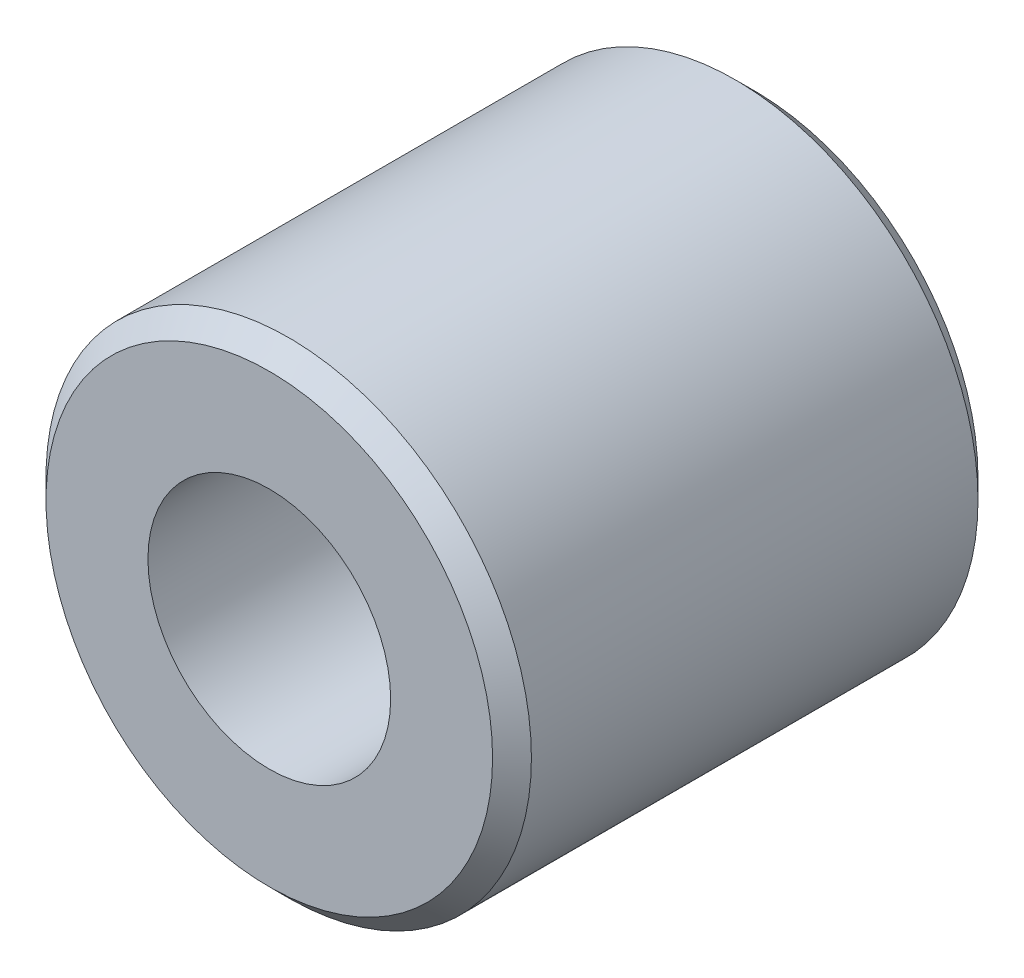
ISO-10303-21;
HEADER;
FILE_DESCRIPTION(('STEP AP214'),'2;1');
FILE_NAME('part.step','',(''),(''),'','','');
FILE_SCHEMA(('AUTOMOTIVE_DESIGN { 1 0 10303 214 1 1 1 1 }'));
ENDSEC;
DATA;
#1=APPLICATION_CONTEXT('core data for automotive mechanical design processes');
#2=APPLICATION_PROTOCOL_DEFINITION('international standard','automotive_design',2000,#1);
#3=PRODUCT_CONTEXT('',#1,'mechanical');
#4=PRODUCT('Part','Part','',(#3));
#5=PRODUCT_RELATED_PRODUCT_CATEGORY('part','',(#4));
#6=PRODUCT_DEFINITION_FORMATION('','',#4);
#7=PRODUCT_DEFINITION_CONTEXT('part definition',#1,'design');
#8=PRODUCT_DEFINITION('design','',#6,#7);
#9=PRODUCT_DEFINITION_SHAPE('','',#8);
#10=(LENGTH_UNIT() NAMED_UNIT(*) SI_UNIT(.MILLI.,.METRE.));
#11=(NAMED_UNIT(*) PLANE_ANGLE_UNIT() SI_UNIT($,.RADIAN.));
#12=(NAMED_UNIT(*) SI_UNIT($,.STERADIAN.) SOLID_ANGLE_UNIT());
#13=UNCERTAINTY_MEASURE_WITH_UNIT(LENGTH_MEASURE(1.E-05),#10,'distance_accuracy_value','');
#14=(GEOMETRIC_REPRESENTATION_CONTEXT(3) GLOBAL_UNCERTAINTY_ASSIGNED_CONTEXT((#13)) GLOBAL_UNIT_ASSIGNED_CONTEXT((#10,
#11,#12)) REPRESENTATION_CONTEXT('',''));
#15=CARTESIAN_POINT('',(0.,0.,0.));
#16=DIRECTION('',(0.,0.,1.));
#17=DIRECTION('',(1.,0.,0.));
#18=AXIS2_PLACEMENT_3D('',#15,#16,#17);
#19=CARTESIAN_POINT('',(0.,0.,5.));
#20=DIRECTION('',(0.,0.,1.));
#21=DIRECTION('',(1.,0.,0.));
#22=AXIS2_PLACEMENT_3D('',#19,#20,#21);
#23=PLANE('',#22);
#24=CARTESIAN_POINT('',(0.,0.,5.));
#25=DIRECTION('',(0.,0.,1.));
#26=DIRECTION('',(1.,0.,0.));
#27=AXIS2_PLACEMENT_3D('',#24,#25,#26);
#28=CIRCLE('',#27,2.3);
#29=CARTESIAN_POINT('',(2.3,0.,5.));
#30=VERTEX_POINT('',#29);
#31=EDGE_CURVE('E10',#30,#30,#28,.T.);
#32=ORIENTED_EDGE('',*,*,#31,.T.);
#33=EDGE_LOOP('',(#32));
#34=FACE_BOUND('',#33,.T.);
#35=CARTESIAN_POINT('',(0.,0.,5.));
#36=DIRECTION('',(0.,0.,1.));
#37=DIRECTION('',(1.,0.,0.));
#38=AXIS2_PLACEMENT_3D('',#35,#36,#37);
#39=CIRCLE('',#38,1.25);
#40=CARTESIAN_POINT('',(1.25,0.,5.));
#41=VERTEX_POINT('',#40);
#42=EDGE_CURVE('E61',#41,#41,#39,.T.);
#43=ORIENTED_EDGE('',*,*,#42,.F.);
#44=EDGE_LOOP('',(#43));
#45=FACE_BOUND('',#44,.T.);
#46=ADVANCED_FACE('F40',(#34,#45),#23,.T.);
#47=CARTESIAN_POINT('',(0.,0.,0.));
#48=DIRECTION('',(0.,0.,1.));
#49=DIRECTION('',(1.,0.,0.));
#50=AXIS2_PLACEMENT_3D('',#47,#48,#49);
#51=PLANE('',#50);
#52=CARTESIAN_POINT('',(0.,0.,0.));
#53=DIRECTION('',(0.,0.,1.));
#54=DIRECTION('',(1.,0.,0.));
#55=AXIS2_PLACEMENT_3D('',#52,#53,#54);
#56=CIRCLE('',#55,2.3);
#57=CARTESIAN_POINT('',(2.3,0.,0.));
#58=VERTEX_POINT('',#57);
#59=EDGE_CURVE('E48',#58,#58,#56,.F.);
#60=ORIENTED_EDGE('',*,*,#59,.T.);
#61=EDGE_LOOP('',(#60));
#62=FACE_BOUND('',#61,.T.);
#63=CARTESIAN_POINT('',(0.,0.,0.));
#64=DIRECTION('',(0.,0.,1.));
#65=DIRECTION('',(1.,0.,0.));
#66=AXIS2_PLACEMENT_3D('',#63,#64,#65);
#67=CIRCLE('',#66,1.25);
#68=CARTESIAN_POINT('',(1.25,0.,0.));
#69=VERTEX_POINT('',#68);
#70=EDGE_CURVE('E62',#69,#69,#67,.T.);
#71=ORIENTED_EDGE('',*,*,#70,.T.);
#72=EDGE_LOOP('',(#71));
#73=FACE_BOUND('',#72,.T.);
#74=ADVANCED_FACE('F72',(#62,#73),#51,.F.);
#75=CARTESIAN_POINT('',(0.,0.,5.));
#76=DIRECTION('',(0.,0.,-1.));
#77=DIRECTION('',(-1.,0.,0.));
#78=AXIS2_PLACEMENT_3D('',#75,#76,#77);
#79=CYLINDRICAL_SURFACE('',#78,2.5);
#80=CARTESIAN_POINT('',(0.,0.,0.2));
#81=DIRECTION('',(0.,0.,1.));
#82=DIRECTION('',(1.,0.,0.));
#83=AXIS2_PLACEMENT_3D('',#80,#81,#82);
#84=CIRCLE('',#83,2.5);
#85=CARTESIAN_POINT('',(2.5,0.,0.2));
#86=VERTEX_POINT('',#85);
#87=EDGE_CURVE('E52',#86,#86,#84,.T.);
#88=ORIENTED_EDGE('',*,*,#87,.T.);
#89=EDGE_LOOP('',(#88));
#90=FACE_BOUND('',#89,.T.);
#91=CARTESIAN_POINT('',(0.,0.,4.8));
#92=DIRECTION('',(0.,0.,1.));
#93=DIRECTION('',(1.,0.,0.));
#94=AXIS2_PLACEMENT_3D('',#91,#92,#93);
#95=CIRCLE('',#94,2.5);
#96=CARTESIAN_POINT('',(2.5,0.,4.8));
#97=VERTEX_POINT('',#96);
#98=EDGE_CURVE('E56',#97,#97,#95,.F.);
#99=ORIENTED_EDGE('',*,*,#98,.T.);
#100=EDGE_LOOP('',(#99));
#101=FACE_BOUND('',#100,.T.);
#102=ADVANCED_FACE('F77',(#90,#101),#79,.T.);
#103=CARTESIAN_POINT('',(0.,0.,5.));
#104=DIRECTION('',(0.,0.,-1.));
#105=DIRECTION('',(-1.,0.,0.));
#106=AXIS2_PLACEMENT_3D('',#103,#104,#105);
#107=CYLINDRICAL_SURFACE('',#106,1.25);
#108=ORIENTED_EDGE('',*,*,#42,.T.);
#109=EDGE_LOOP('',(#108));
#110=FACE_BOUND('',#109,.T.);
#111=ORIENTED_EDGE('',*,*,#70,.F.);
#112=EDGE_LOOP('',(#111));
#113=FACE_BOUND('',#112,.T.);
#114=ADVANCED_FACE('F68',(#110,#113),#107,.F.);
#115=CARTESIAN_POINT('',(0.,0.,0.2));
#116=DIRECTION('',(0.,0.,1.));
#117=DIRECTION('',(1.,0.,0.));
#118=AXIS2_PLACEMENT_3D('',#115,#116,#117);
#119=CONICAL_SURFACE('',#118,2.5,0.785398163397449);
#120=CARTESIAN_POINT('',(2.3,0.,0.));
#121=CARTESIAN_POINT('',(2.30208333333333,0.,0.00208333333333336));
#122=CARTESIAN_POINT('',(2.30416666666667,0.,0.00416666666666668));
#123=CARTESIAN_POINT('',(2.30833333333333,0.,0.00833333333333332));
#124=CARTESIAN_POINT('',(2.31041666666667,0.,0.0104166666666666));
#125=CARTESIAN_POINT('',(2.31458333333333,0.,0.0145833333333333));
#126=CARTESIAN_POINT('',(2.31666666666667,0.,0.0166666666666666));
#127=CARTESIAN_POINT('',(2.32083333333333,0.,0.0208333333333332));
#128=CARTESIAN_POINT('',(2.32291666666667,0.,0.0229166666666666));
#129=CARTESIAN_POINT('',(2.32708333333333,0.,0.0270833333333333));
#130=CARTESIAN_POINT('',(2.32916666666667,0.,0.0291666666666666));
#131=CARTESIAN_POINT('',(2.33333333333333,0.,0.0333333333333332));
#132=CARTESIAN_POINT('',(2.33541666666667,0.,0.0354166666666666));
#133=CARTESIAN_POINT('',(2.33958333333333,0.,0.0395833333333333));
#134=CARTESIAN_POINT('',(2.34166666666667,0.,0.0416666666666666));
#135=CARTESIAN_POINT('',(2.34583333333333,0.,0.0458333333333332));
#136=CARTESIAN_POINT('',(2.34791666666667,0.,0.0479166666666665));
#137=CARTESIAN_POINT('',(2.35208333333333,0.,0.0520833333333332));
#138=CARTESIAN_POINT('',(2.35416666666667,0.,0.0541666666666666));
#139=CARTESIAN_POINT('',(2.35833333333333,0.,0.0583333333333333));
#140=CARTESIAN_POINT('',(2.36041666666667,0.,0.0604166666666665));
#141=CARTESIAN_POINT('',(2.36458333333333,0.,0.0645833333333332));
#142=CARTESIAN_POINT('',(2.36666666666667,0.,0.0666666666666666));
#143=CARTESIAN_POINT('',(2.37083333333333,0.,0.0708333333333333));
#144=CARTESIAN_POINT('',(2.37291666666667,0.,0.0729166666666666));
#145=CARTESIAN_POINT('',(2.37708333333333,0.,0.0770833333333332));
#146=CARTESIAN_POINT('',(2.37916666666667,0.,0.0791666666666665));
#147=CARTESIAN_POINT('',(2.38333333333333,0.,0.0833333333333331));
#148=CARTESIAN_POINT('',(2.38541666666667,0.,0.0854166666666665));
#149=CARTESIAN_POINT('',(2.38958333333333,0.,0.0895833333333332));
#150=CARTESIAN_POINT('',(2.39166666666667,0.,0.0916666666666665));
#151=CARTESIAN_POINT('',(2.39583333333333,0.,0.0958333333333331));
#152=CARTESIAN_POINT('',(2.39791666666667,0.,0.0979166666666665));
#153=CARTESIAN_POINT('',(2.40208333333333,0.,0.102083333333333));
#154=CARTESIAN_POINT('',(2.40416666666667,0.,0.104166666666666));
#155=CARTESIAN_POINT('',(2.40833333333333,0.,0.108333333333333));
#156=CARTESIAN_POINT('',(2.41041666666667,0.,0.110416666666666));
#157=CARTESIAN_POINT('',(2.41458333333333,0.,0.114583333333333));
#158=CARTESIAN_POINT('',(2.41666666666667,0.,0.116666666666666));
#159=CARTESIAN_POINT('',(2.42083333333333,0.,0.120833333333333));
#160=CARTESIAN_POINT('',(2.42291666666667,0.,0.122916666666666));
#161=CARTESIAN_POINT('',(2.42708333333333,0.,0.127083333333333));
#162=CARTESIAN_POINT('',(2.42916666666667,0.,0.129166666666666));
#163=CARTESIAN_POINT('',(2.43333333333333,0.,0.133333333333333));
#164=CARTESIAN_POINT('',(2.43541666666667,0.,0.135416666666666));
#165=CARTESIAN_POINT('',(2.43958333333333,0.,0.139583333333333));
#166=CARTESIAN_POINT('',(2.44166666666667,0.,0.141666666666666));
#167=CARTESIAN_POINT('',(2.44583333333333,0.,0.145833333333333));
#168=CARTESIAN_POINT('',(2.44791666666667,0.,0.147916666666666));
#169=CARTESIAN_POINT('',(2.45208333333333,0.,0.152083333333333));
#170=CARTESIAN_POINT('',(2.45416666666667,0.,0.154166666666666));
#171=CARTESIAN_POINT('',(2.45833333333333,0.,0.158333333333333));
#172=CARTESIAN_POINT('',(2.46041666666667,0.,0.160416666666666));
#173=CARTESIAN_POINT('',(2.46458333333333,0.,0.164583333333333));
#174=CARTESIAN_POINT('',(2.46666666666667,0.,0.166666666666666));
#175=CARTESIAN_POINT('',(2.47083333333333,0.,0.170833333333333));
#176=CARTESIAN_POINT('',(2.47291666666667,0.,0.172916666666666));
#177=CARTESIAN_POINT('',(2.47708333333333,0.,0.177083333333333));
#178=CARTESIAN_POINT('',(2.47916666666667,0.,0.179166666666666));
#179=CARTESIAN_POINT('',(2.48333333333333,0.,0.183333333333333));
#180=CARTESIAN_POINT('',(2.48541666666667,0.,0.185416666666666));
#181=CARTESIAN_POINT('',(2.48958333333333,0.,0.189583333333333));
#182=CARTESIAN_POINT('',(2.49166666666667,0.,0.191666666666666));
#183=CARTESIAN_POINT('',(2.49583333333333,0.,0.195833333333333));
#184=CARTESIAN_POINT('',(2.49791666666667,0.,0.197916666666666));
#185=CARTESIAN_POINT('',(2.5,0.,0.2));
#186=B_SPLINE_CURVE_WITH_KNOTS('',3,(#120,#121,#122,#123,#124,#125,#126,#127,#128,#129,#130,
#131,#132,#133,#134,#135,#136,#137,#138,#139,#140,#141,#142,#143,#144,#145,#146,#147,#148,#149,
#150,#151,#152,#153,#154,#155,#156,#157,#158,#159,#160,#161,#162,#163,#164,#165,#166,#167,#168,
#169,#170,#171,#172,#173,#174,#175,#176,#177,#178,#179,#180,#181,#182,#183,#184,#185),
.UNSPECIFIED.,.F.,.F.,(4,2,2,2,2,2,2,2,2,2,2,2,2,2,2,2,2,2,2,2,2,2,2,2,2,2,2,2,2,2,2,2,4),(0.,
0.00883883476483166,0.0176776695296636,0.0265165042944956,0.0353553390593272,0.0441941738241592,
0.0530330085889908,0.0618718433538228,0.0707106781186548,0.0795495128834865,0.0883883476483184,
0.0972271824131501,0.106066017177982,0.114904851942814,0.123743686707646,0.132582521472478,
0.141421356237309,0.150260191002141,0.159099025766973,0.167937860531805,0.176776695296637,
0.185615530061468,0.1944543648263,0.203293199591132,0.212132034355964,0.220970869120796,
0.229809703885628,0.23864853865046,0.247487373415292,0.256326208180123,0.265165042944955,
0.274003877709787,0.282842712474619),.UNSPECIFIED.);
#187=EDGE_CURVE('BSEAM84',#58,#86,#186,.T.);
#188=ORIENTED_EDGE('',*,*,#59,.F.);
#189=ORIENTED_EDGE('',*,*,#87,.F.);
#190=ORIENTED_EDGE('',*,*,#187,.T.);
#191=ORIENTED_EDGE('',*,*,#187,.F.);
#192=EDGE_LOOP('',(#188,#190,#189,#191));
#193=FACE_BOUND('',#192,.T.);
#194=ADVANCED_FACE('F84',(#193),#119,.T.);
#195=CARTESIAN_POINT('',(0.,0.,5.));
#196=DIRECTION('',(0.,0.,-1.));
#197=DIRECTION('',(-1.,0.,0.));
#198=AXIS2_PLACEMENT_3D('',#195,#196,#197);
#199=CONICAL_SURFACE('',#198,2.3,0.785398163397443);
#200=ORIENTED_EDGE('',*,*,#98,.F.);
#201=EDGE_LOOP('',(#200));
#202=FACE_BOUND('',#201,.T.);
#203=ORIENTED_EDGE('',*,*,#31,.F.);
#204=EDGE_LOOP('',(#203));
#205=FACE_BOUND('',#204,.T.);
#206=ADVANCED_FACE('F43',(#202,#205),#199,.T.);
#207=CLOSED_SHELL('',(#46,#74,#102,#114,#194,#206));
#208=MANIFOLD_SOLID_BREP('B2',#207);
#209=ADVANCED_BREP_SHAPE_REPRESENTATION('',(#18,#208),#14);
#210=SHAPE_DEFINITION_REPRESENTATION(#9,#209);
ENDSEC;
END-ISO-10303-21;
